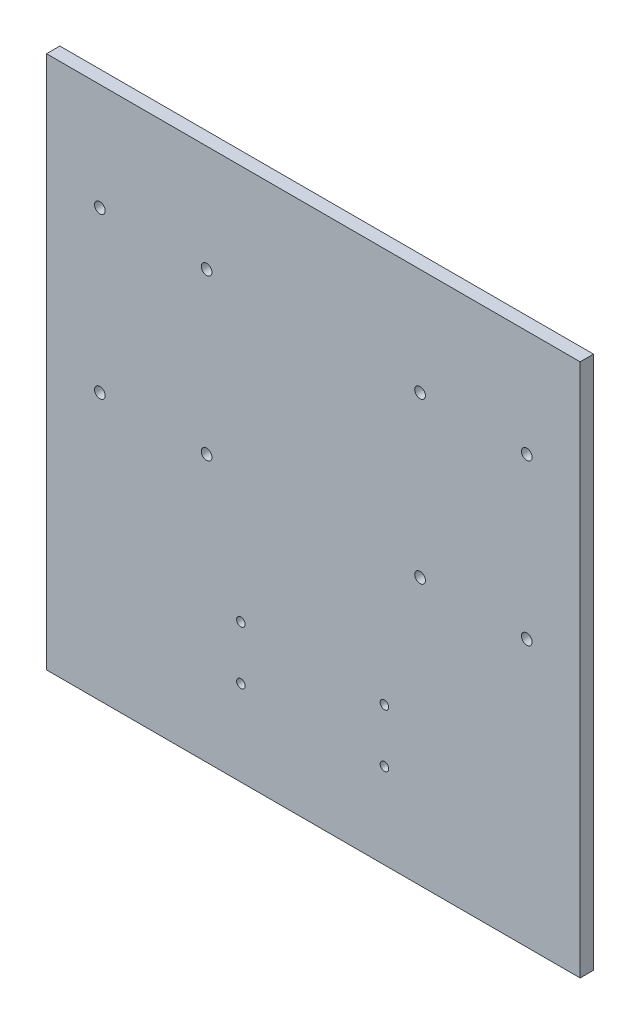
ISO-10303-21;
HEADER;
FILE_DESCRIPTION(('STEP AP214'),'2;1');
FILE_NAME('part.step','',(''),(''),'','','');
FILE_SCHEMA(('AUTOMOTIVE_DESIGN { 1 0 10303 214 1 1 1 1 }'));
ENDSEC;
DATA;
#1=APPLICATION_CONTEXT('core data for automotive mechanical design processes');
#2=APPLICATION_PROTOCOL_DEFINITION('international standard','automotive_design',2000,#1);
#3=PRODUCT_CONTEXT('',#1,'mechanical');
#4=PRODUCT('Part','Part','',(#3));
#5=PRODUCT_RELATED_PRODUCT_CATEGORY('part','',(#4));
#6=PRODUCT_DEFINITION_FORMATION('','',#4);
#7=PRODUCT_DEFINITION_CONTEXT('part definition',#1,'design');
#8=PRODUCT_DEFINITION('design','',#6,#7);
#9=PRODUCT_DEFINITION_SHAPE('','',#8);
#10=(LENGTH_UNIT() NAMED_UNIT(*) SI_UNIT(.MILLI.,.METRE.));
#11=(NAMED_UNIT(*) PLANE_ANGLE_UNIT() SI_UNIT($,.RADIAN.));
#12=(NAMED_UNIT(*) SI_UNIT($,.STERADIAN.) SOLID_ANGLE_UNIT());
#13=UNCERTAINTY_MEASURE_WITH_UNIT(LENGTH_MEASURE(1.E-05),#10,'distance_accuracy_value','');
#14=(GEOMETRIC_REPRESENTATION_CONTEXT(3) GLOBAL_UNCERTAINTY_ASSIGNED_CONTEXT((#13)) GLOBAL_UNIT_ASSIGNED_CONTEXT((#10,
#11,#12)) REPRESENTATION_CONTEXT('',''));
#15=CARTESIAN_POINT('',(0.,0.,0.));
#16=DIRECTION('',(0.,0.,1.));
#17=DIRECTION('',(1.,0.,0.));
#18=AXIS2_PLACEMENT_3D('',#15,#16,#17);
#19=CARTESIAN_POINT('',(100.,100.,5.));
#20=DIRECTION('',(-1.,0.,0.));
#21=DIRECTION('',(0.,-1.,0.));
#22=AXIS2_PLACEMENT_3D('',#19,#20,#21);
#23=PLANE('',#22);
#24=DIRECTION('',(0.,1.,0.));
#25=VECTOR('',#24,1.);
#26=CARTESIAN_POINT('',(100.,100.,0.));
#27=LINE('',#26,#25);
#28=CARTESIAN_POINT('',(100.,-100.,0.));
#29=VERTEX_POINT('',#28);
#30=CARTESIAN_POINT('',(100.,100.,0.));
#31=VERTEX_POINT('',#30);
#32=EDGE_CURVE('E102',#29,#31,#27,.T.);
#33=ORIENTED_EDGE('',*,*,#32,.T.);
#34=DIRECTION('',(0.,0.,-1.));
#35=VECTOR('',#34,1.);
#36=CARTESIAN_POINT('',(100.,100.,5.));
#37=LINE('',#36,#35);
#38=CARTESIAN_POINT('',(100.,100.,5.));
#39=VERTEX_POINT('',#38);
#40=EDGE_CURVE('E11',#39,#31,#37,.T.);
#41=ORIENTED_EDGE('',*,*,#40,.F.);
#42=DIRECTION('',(0.,1.,0.));
#43=VECTOR('',#42,1.);
#44=CARTESIAN_POINT('',(100.,100.,5.));
#45=LINE('',#44,#43);
#46=CARTESIAN_POINT('',(100.,-100.,5.));
#47=VERTEX_POINT('',#46);
#48=EDGE_CURVE('E90',#47,#39,#45,.T.);
#49=ORIENTED_EDGE('',*,*,#48,.F.);
#50=DIRECTION('',(0.,0.,-1.));
#51=VECTOR('',#50,1.);
#52=CARTESIAN_POINT('',(100.,-100.,5.));
#53=LINE('',#52,#51);
#54=EDGE_CURVE('E98',#47,#29,#53,.T.);
#55=ORIENTED_EDGE('',*,*,#54,.T.);
#56=EDGE_LOOP('',(#33,#41,#49,#55));
#57=FACE_BOUND('',#56,.T.);
#58=ADVANCED_FACE('F39',(#57),#23,.F.);
#59=CARTESIAN_POINT('',(-100.,100.,5.));
#60=DIRECTION('',(0.,-1.,0.));
#61=DIRECTION('',(0.,0.,-1.));
#62=AXIS2_PLACEMENT_3D('',#59,#60,#61);
#63=PLANE('',#62);
#64=DIRECTION('',(-1.,0.,0.));
#65=VECTOR('',#64,1.);
#66=CARTESIAN_POINT('',(-100.,100.,0.));
#67=LINE('',#66,#65);
#68=CARTESIAN_POINT('',(-100.,100.,0.));
#69=VERTEX_POINT('',#68);
#70=EDGE_CURVE('E94',#31,#69,#67,.T.);
#71=ORIENTED_EDGE('',*,*,#70,.T.);
#72=DIRECTION('',(0.,0.,-1.));
#73=VECTOR('',#72,1.);
#74=CARTESIAN_POINT('',(-100.,100.,5.));
#75=LINE('',#74,#73);
#76=CARTESIAN_POINT('',(-100.,100.,5.));
#77=VERTEX_POINT('',#76);
#78=EDGE_CURVE('E47',#77,#69,#75,.T.);
#79=ORIENTED_EDGE('',*,*,#78,.F.);
#80=DIRECTION('',(-1.,0.,0.));
#81=VECTOR('',#80,1.);
#82=CARTESIAN_POINT('',(-100.,100.,5.));
#83=LINE('',#82,#81);
#84=EDGE_CURVE('E85',#39,#77,#83,.T.);
#85=ORIENTED_EDGE('',*,*,#84,.F.);
#86=ORIENTED_EDGE('',*,*,#40,.T.);
#87=EDGE_LOOP('',(#71,#79,#85,#86));
#88=FACE_BOUND('',#87,.T.);
#89=ADVANCED_FACE('F93',(#88),#63,.F.);
#90=CARTESIAN_POINT('',(-100.,100.,5.));
#91=DIRECTION('',(1.,0.,0.));
#92=DIRECTION('',(0.,1.,0.));
#93=AXIS2_PLACEMENT_3D('',#90,#91,#92);
#94=PLANE('',#93);
#95=DIRECTION('',(0.,-1.,0.));
#96=VECTOR('',#95,1.);
#97=CARTESIAN_POINT('',(-100.,100.,0.));
#98=LINE('',#97,#96);
#99=CARTESIAN_POINT('',(-100.,-100.,0.));
#100=VERTEX_POINT('',#99);
#101=EDGE_CURVE('E72',#69,#100,#98,.T.);
#102=ORIENTED_EDGE('',*,*,#101,.T.);
#103=DIRECTION('',(0.,0.,-1.));
#104=VECTOR('',#103,1.);
#105=CARTESIAN_POINT('',(-100.,-100.,5.));
#106=LINE('',#105,#104);
#107=CARTESIAN_POINT('',(-100.,-100.,5.));
#108=VERTEX_POINT('',#107);
#109=EDGE_CURVE('E95',#108,#100,#106,.T.);
#110=ORIENTED_EDGE('',*,*,#109,.F.);
#111=DIRECTION('',(0.,-1.,0.));
#112=VECTOR('',#111,1.);
#113=CARTESIAN_POINT('',(-100.,100.,5.));
#114=LINE('',#113,#112);
#115=EDGE_CURVE('E88',#77,#108,#114,.T.);
#116=ORIENTED_EDGE('',*,*,#115,.F.);
#117=ORIENTED_EDGE('',*,*,#78,.T.);
#118=EDGE_LOOP('',(#102,#110,#116,#117));
#119=FACE_BOUND('',#118,.T.);
#120=ADVANCED_FACE('F96',(#119),#94,.F.);
#121=CARTESIAN_POINT('',(-100.,-100.,5.));
#122=DIRECTION('',(0.,1.,0.));
#123=DIRECTION('',(0.,0.,1.));
#124=AXIS2_PLACEMENT_3D('',#121,#122,#123);
#125=PLANE('',#124);
#126=DIRECTION('',(1.,0.,0.));
#127=VECTOR('',#126,1.);
#128=CARTESIAN_POINT('',(-100.,-100.,0.));
#129=LINE('',#128,#127);
#130=EDGE_CURVE('E78',#100,#29,#129,.T.);
#131=ORIENTED_EDGE('',*,*,#130,.T.);
#132=ORIENTED_EDGE('',*,*,#54,.F.);
#133=DIRECTION('',(1.,0.,0.));
#134=VECTOR('',#133,1.);
#135=CARTESIAN_POINT('',(-100.,-100.,5.));
#136=LINE('',#135,#134);
#137=EDGE_CURVE('E55',#108,#47,#136,.T.);
#138=ORIENTED_EDGE('',*,*,#137,.F.);
#139=ORIENTED_EDGE('',*,*,#109,.T.);
#140=EDGE_LOOP('',(#131,#132,#138,#139));
#141=FACE_BOUND('',#140,.T.);
#142=ADVANCED_FACE('F110',(#141),#125,.F.);
#143=CARTESIAN_POINT('',(0.,0.,5.));
#144=DIRECTION('',(0.,0.,1.));
#145=DIRECTION('',(1.,0.,0.));
#146=AXIS2_PLACEMENT_3D('',#143,#144,#145);
#147=PLANE('',#146);
#148=CARTESIAN_POINT('',(80.,0.,5.));
#149=DIRECTION('',(0.,0.,1.));
#150=DIRECTION('',(1.,0.,0.));
#151=AXIS2_PLACEMENT_3D('',#148,#149,#150);
#152=CIRCLE('',#151,2.);
#153=CARTESIAN_POINT('',(82.,0.,5.));
#154=VERTEX_POINT('',#153);
#155=EDGE_CURVE('E161',#154,#154,#152,.T.);
#156=ORIENTED_EDGE('',*,*,#155,.F.);
#157=EDGE_LOOP('',(#156));
#158=FACE_BOUND('',#157,.T.);
#159=CARTESIAN_POINT('',(-80.,0.,5.));
#160=DIRECTION('',(0.,0.,1.));
#161=DIRECTION('',(-1.,0.,0.));
#162=AXIS2_PLACEMENT_3D('',#159,#160,#161);
#163=CIRCLE('',#162,2.);
#164=CARTESIAN_POINT('',(-82.,0.,5.));
#165=VERTEX_POINT('',#164);
#166=EDGE_CURVE('E150',#165,#165,#163,.T.);
#167=ORIENTED_EDGE('',*,*,#166,.F.);
#168=EDGE_LOOP('',(#167));
#169=FACE_BOUND('',#168,.T.);
#170=CARTESIAN_POINT('',(-40.,0.,5.));
#171=DIRECTION('',(0.,0.,1.));
#172=DIRECTION('',(-1.,0.,0.));
#173=AXIS2_PLACEMENT_3D('',#170,#171,#172);
#174=CIRCLE('',#173,2.);
#175=CARTESIAN_POINT('',(-42.,0.,5.));
#176=VERTEX_POINT('',#175);
#177=EDGE_CURVE('E149',#176,#176,#174,.T.);
#178=ORIENTED_EDGE('',*,*,#177,.F.);
#179=EDGE_LOOP('',(#178));
#180=FACE_BOUND('',#179,.T.);
#181=CARTESIAN_POINT('',(-40.,60.,5.));
#182=DIRECTION('',(0.,0.,1.));
#183=DIRECTION('',(1.,0.,0.));
#184=AXIS2_PLACEMENT_3D('',#181,#182,#183);
#185=CIRCLE('',#184,2.);
#186=CARTESIAN_POINT('',(-38.,60.,5.));
#187=VERTEX_POINT('',#186);
#188=EDGE_CURVE('E143',#187,#187,#185,.T.);
#189=ORIENTED_EDGE('',*,*,#188,.F.);
#190=EDGE_LOOP('',(#189));
#191=FACE_BOUND('',#190,.T.);
#192=CARTESIAN_POINT('',(40.,0.,5.));
#193=DIRECTION('',(0.,0.,1.));
#194=DIRECTION('',(1.,0.,0.));
#195=AXIS2_PLACEMENT_3D('',#192,#193,#194);
#196=CIRCLE('',#195,2.);
#197=CARTESIAN_POINT('',(42.,0.,5.));
#198=VERTEX_POINT('',#197);
#199=EDGE_CURVE('E162',#198,#198,#196,.T.);
#200=ORIENTED_EDGE('',*,*,#199,.F.);
#201=EDGE_LOOP('',(#200));
#202=FACE_BOUND('',#201,.T.);
#203=CARTESIAN_POINT('',(40.,60.,5.));
#204=DIRECTION('',(0.,0.,1.));
#205=DIRECTION('',(-1.,0.,0.));
#206=AXIS2_PLACEMENT_3D('',#203,#204,#205);
#207=CIRCLE('',#206,2.);
#208=CARTESIAN_POINT('',(38.,60.,5.));
#209=VERTEX_POINT('',#208);
#210=EDGE_CURVE('E179',#209,#209,#207,.T.);
#211=ORIENTED_EDGE('',*,*,#210,.F.);
#212=EDGE_LOOP('',(#211));
#213=FACE_BOUND('',#212,.T.);
#214=CARTESIAN_POINT('',(80.,60.,5.));
#215=DIRECTION('',(0.,0.,1.));
#216=DIRECTION('',(-1.,0.,0.));
#217=AXIS2_PLACEMENT_3D('',#214,#215,#216);
#218=CIRCLE('',#217,2.);
#219=CARTESIAN_POINT('',(78.,60.,5.));
#220=VERTEX_POINT('',#219);
#221=EDGE_CURVE('E173',#220,#220,#218,.T.);
#222=ORIENTED_EDGE('',*,*,#221,.F.);
#223=EDGE_LOOP('',(#222));
#224=FACE_BOUND('',#223,.T.);
#225=CARTESIAN_POINT('',(-80.,60.,5.));
#226=DIRECTION('',(0.,0.,1.));
#227=DIRECTION('',(1.,0.,0.));
#228=AXIS2_PLACEMENT_3D('',#225,#226,#227);
#229=CIRCLE('',#228,2.);
#230=CARTESIAN_POINT('',(-78.,60.,5.));
#231=VERTEX_POINT('',#230);
#232=EDGE_CURVE('E140',#231,#231,#229,.T.);
#233=ORIENTED_EDGE('',*,*,#232,.F.);
#234=EDGE_LOOP('',(#233));
#235=FACE_BOUND('',#234,.T.);
#236=CARTESIAN_POINT('',(26.65,-68.,5.));
#237=DIRECTION('',(0.,0.,1.));
#238=DIRECTION('',(1.,0.,0.));
#239=AXIS2_PLACEMENT_3D('',#236,#237,#238);
#240=CIRCLE('',#239,1.60000000000001);
#241=CARTESIAN_POINT('',(28.25,-68.,5.));
#242=VERTEX_POINT('',#241);
#243=EDGE_CURVE('E125',#242,#242,#240,.T.);
#244=ORIENTED_EDGE('',*,*,#243,.F.);
#245=EDGE_LOOP('',(#244));
#246=FACE_BOUND('',#245,.T.);
#247=CARTESIAN_POINT('',(26.65,-48.,5.));
#248=DIRECTION('',(0.,0.,1.));
#249=DIRECTION('',(1.,0.,0.));
#250=AXIS2_PLACEMENT_3D('',#247,#248,#249);
#251=CIRCLE('',#250,1.60000000000001);
#252=CARTESIAN_POINT('',(28.25,-48.,5.));
#253=VERTEX_POINT('',#252);
#254=EDGE_CURVE('E132',#253,#253,#251,.T.);
#255=ORIENTED_EDGE('',*,*,#254,.F.);
#256=EDGE_LOOP('',(#255));
#257=FACE_BOUND('',#256,.T.);
#258=CARTESIAN_POINT('',(-27.1499999999999,-47.9999999999996,5.));
#259=DIRECTION('',(0.,0.,1.));
#260=DIRECTION('',(1.,0.,0.));
#261=AXIS2_PLACEMENT_3D('',#258,#259,#260);
#262=CIRCLE('',#261,1.60000000000001);
#263=CARTESIAN_POINT('',(-25.5499999999999,-47.9999999999996,5.));
#264=VERTEX_POINT('',#263);
#265=EDGE_CURVE('E119',#264,#264,#262,.T.);
#266=ORIENTED_EDGE('',*,*,#265,.F.);
#267=EDGE_LOOP('',(#266));
#268=FACE_BOUND('',#267,.T.);
#269=CARTESIAN_POINT('',(-27.1499999999999,-67.9999999999996,5.));
#270=DIRECTION('',(0.,0.,1.));
#271=DIRECTION('',(1.,0.,0.));
#272=AXIS2_PLACEMENT_3D('',#269,#270,#271);
#273=CIRCLE('',#272,1.60000000000001);
#274=CARTESIAN_POINT('',(-25.5499999999999,-67.9999999999996,5.));
#275=VERTEX_POINT('',#274);
#276=EDGE_CURVE('E116',#275,#275,#273,.T.);
#277=ORIENTED_EDGE('',*,*,#276,.F.);
#278=EDGE_LOOP('',(#277));
#279=FACE_BOUND('',#278,.T.);
#280=ORIENTED_EDGE('',*,*,#48,.T.);
#281=ORIENTED_EDGE('',*,*,#84,.T.);
#282=ORIENTED_EDGE('',*,*,#115,.T.);
#283=ORIENTED_EDGE('',*,*,#137,.T.);
#284=EDGE_LOOP('',(#280,#281,#282,#283));
#285=FACE_BOUND('',#284,.T.);
#286=ADVANCED_FACE('F86',(#158,#169,#180,#191,#202,#213,#224,#235,#246,#257,#268,#279,#285),
#147,.T.);
#287=CARTESIAN_POINT('',(0.,0.,0.));
#288=DIRECTION('',(0.,0.,1.));
#289=DIRECTION('',(1.,0.,0.));
#290=AXIS2_PLACEMENT_3D('',#287,#288,#289);
#291=PLANE('',#290);
#292=CARTESIAN_POINT('',(80.,0.,0.));
#293=DIRECTION('',(0.,0.,1.));
#294=DIRECTION('',(1.,0.,0.));
#295=AXIS2_PLACEMENT_3D('',#292,#293,#294);
#296=CIRCLE('',#295,2.);
#297=CARTESIAN_POINT('',(82.,0.,0.));
#298=VERTEX_POINT('',#297);
#299=EDGE_CURVE('E158',#298,#298,#296,.T.);
#300=ORIENTED_EDGE('',*,*,#299,.T.);
#301=EDGE_LOOP('',(#300));
#302=FACE_BOUND('',#301,.T.);
#303=CARTESIAN_POINT('',(-80.,0.,0.));
#304=DIRECTION('',(0.,0.,1.));
#305=DIRECTION('',(-1.,0.,0.));
#306=AXIS2_PLACEMENT_3D('',#303,#304,#305);
#307=CIRCLE('',#306,2.);
#308=CARTESIAN_POINT('',(-82.,0.,0.));
#309=VERTEX_POINT('',#308);
#310=EDGE_CURVE('E165',#309,#309,#307,.T.);
#311=ORIENTED_EDGE('',*,*,#310,.T.);
#312=EDGE_LOOP('',(#311));
#313=FACE_BOUND('',#312,.T.);
#314=CARTESIAN_POINT('',(-40.,0.,0.));
#315=DIRECTION('',(0.,0.,1.));
#316=DIRECTION('',(-1.,0.,0.));
#317=AXIS2_PLACEMENT_3D('',#314,#315,#316);
#318=CIRCLE('',#317,2.);
#319=CARTESIAN_POINT('',(-42.,0.,0.));
#320=VERTEX_POINT('',#319);
#321=EDGE_CURVE('E146',#320,#320,#318,.T.);
#322=ORIENTED_EDGE('',*,*,#321,.T.);
#323=EDGE_LOOP('',(#322));
#324=FACE_BOUND('',#323,.T.);
#325=CARTESIAN_POINT('',(-40.,60.,0.));
#326=DIRECTION('',(0.,0.,1.));
#327=DIRECTION('',(1.,0.,0.));
#328=AXIS2_PLACEMENT_3D('',#325,#326,#327);
#329=CIRCLE('',#328,2.);
#330=CARTESIAN_POINT('',(-38.,60.,0.));
#331=VERTEX_POINT('',#330);
#332=EDGE_CURVE('E153',#331,#331,#329,.T.);
#333=ORIENTED_EDGE('',*,*,#332,.T.);
#334=EDGE_LOOP('',(#333));
#335=FACE_BOUND('',#334,.T.);
#336=CARTESIAN_POINT('',(40.,0.,0.));
#337=DIRECTION('',(0.,0.,1.));
#338=DIRECTION('',(1.,0.,0.));
#339=AXIS2_PLACEMENT_3D('',#336,#337,#338);
#340=CIRCLE('',#339,2.);
#341=CARTESIAN_POINT('',(42.,0.,0.));
#342=VERTEX_POINT('',#341);
#343=EDGE_CURVE('E182',#342,#342,#340,.T.);
#344=ORIENTED_EDGE('',*,*,#343,.T.);
#345=EDGE_LOOP('',(#344));
#346=FACE_BOUND('',#345,.T.);
#347=CARTESIAN_POINT('',(40.,60.,0.));
#348=DIRECTION('',(0.,0.,1.));
#349=DIRECTION('',(-1.,0.,0.));
#350=AXIS2_PLACEMENT_3D('',#347,#348,#349);
#351=CIRCLE('',#350,2.);
#352=CARTESIAN_POINT('',(38.,60.,0.));
#353=VERTEX_POINT('',#352);
#354=EDGE_CURVE('E176',#353,#353,#351,.T.);
#355=ORIENTED_EDGE('',*,*,#354,.T.);
#356=EDGE_LOOP('',(#355));
#357=FACE_BOUND('',#356,.T.);
#358=CARTESIAN_POINT('',(80.,60.,0.));
#359=DIRECTION('',(0.,0.,1.));
#360=DIRECTION('',(-1.,0.,0.));
#361=AXIS2_PLACEMENT_3D('',#358,#359,#360);
#362=CIRCLE('',#361,2.);
#363=CARTESIAN_POINT('',(78.,60.,0.));
#364=VERTEX_POINT('',#363);
#365=EDGE_CURVE('E170',#364,#364,#362,.T.);
#366=ORIENTED_EDGE('',*,*,#365,.T.);
#367=EDGE_LOOP('',(#366));
#368=FACE_BOUND('',#367,.T.);
#369=CARTESIAN_POINT('',(-80.,60.,0.));
#370=DIRECTION('',(0.,0.,1.));
#371=DIRECTION('',(1.,0.,0.));
#372=AXIS2_PLACEMENT_3D('',#369,#370,#371);
#373=CIRCLE('',#372,2.);
#374=CARTESIAN_POINT('',(-78.,60.,0.));
#375=VERTEX_POINT('',#374);
#376=EDGE_CURVE('E126',#375,#375,#373,.T.);
#377=ORIENTED_EDGE('',*,*,#376,.T.);
#378=EDGE_LOOP('',(#377));
#379=FACE_BOUND('',#378,.T.);
#380=CARTESIAN_POINT('',(26.65,-68.,0.));
#381=DIRECTION('',(0.,0.,1.));
#382=DIRECTION('',(1.,0.,0.));
#383=AXIS2_PLACEMENT_3D('',#380,#381,#382);
#384=CIRCLE('',#383,1.60000000000001);
#385=CARTESIAN_POINT('',(28.25,-68.,0.));
#386=VERTEX_POINT('',#385);
#387=EDGE_CURVE('E122',#386,#386,#384,.T.);
#388=ORIENTED_EDGE('',*,*,#387,.T.);
#389=EDGE_LOOP('',(#388));
#390=FACE_BOUND('',#389,.T.);
#391=CARTESIAN_POINT('',(26.65,-48.,0.));
#392=DIRECTION('',(0.,0.,1.));
#393=DIRECTION('',(1.,0.,0.));
#394=AXIS2_PLACEMENT_3D('',#391,#392,#393);
#395=CIRCLE('',#394,1.60000000000001);
#396=CARTESIAN_POINT('',(28.25,-48.,0.));
#397=VERTEX_POINT('',#396);
#398=EDGE_CURVE('E129',#397,#397,#395,.T.);
#399=ORIENTED_EDGE('',*,*,#398,.T.);
#400=EDGE_LOOP('',(#399));
#401=FACE_BOUND('',#400,.T.);
#402=CARTESIAN_POINT('',(-27.1499999999999,-47.9999999999996,0.));
#403=DIRECTION('',(0.,0.,1.));
#404=DIRECTION('',(1.,0.,0.));
#405=AXIS2_PLACEMENT_3D('',#402,#403,#404);
#406=CIRCLE('',#405,1.60000000000001);
#407=CARTESIAN_POINT('',(-25.5499999999999,-47.9999999999996,0.));
#408=VERTEX_POINT('',#407);
#409=EDGE_CURVE('E135',#408,#408,#406,.T.);
#410=ORIENTED_EDGE('',*,*,#409,.T.);
#411=EDGE_LOOP('',(#410));
#412=FACE_BOUND('',#411,.T.);
#413=CARTESIAN_POINT('',(-27.1499999999999,-67.9999999999996,0.));
#414=DIRECTION('',(0.,0.,1.));
#415=DIRECTION('',(1.,0.,0.));
#416=AXIS2_PLACEMENT_3D('',#413,#414,#415);
#417=CIRCLE('',#416,1.60000000000001);
#418=CARTESIAN_POINT('',(-25.5499999999999,-67.9999999999996,0.));
#419=VERTEX_POINT('',#418);
#420=EDGE_CURVE('E105',#419,#419,#417,.T.);
#421=ORIENTED_EDGE('',*,*,#420,.T.);
#422=EDGE_LOOP('',(#421));
#423=FACE_BOUND('',#422,.T.);
#424=ORIENTED_EDGE('',*,*,#32,.F.);
#425=ORIENTED_EDGE('',*,*,#130,.F.);
#426=ORIENTED_EDGE('',*,*,#101,.F.);
#427=ORIENTED_EDGE('',*,*,#70,.F.);
#428=EDGE_LOOP('',(#424,#425,#426,#427));
#429=FACE_BOUND('',#428,.T.);
#430=ADVANCED_FACE('F113',(#302,#313,#324,#335,#346,#357,#368,#379,#390,#401,#412,#423,#429),
#291,.F.);
#431=CARTESIAN_POINT('',(-27.1499999999999,-67.9999999999996,0.));
#432=DIRECTION('',(0.,0.,1.));
#433=DIRECTION('',(1.,0.,0.));
#434=AXIS2_PLACEMENT_3D('',#431,#432,#433);
#435=CYLINDRICAL_SURFACE('',#434,1.60000000000001);
#436=ORIENTED_EDGE('',*,*,#420,.F.);
#437=EDGE_LOOP('',(#436));
#438=FACE_BOUND('',#437,.T.);
#439=ORIENTED_EDGE('',*,*,#276,.T.);
#440=EDGE_LOOP('',(#439));
#441=FACE_BOUND('',#440,.T.);
#442=ADVANCED_FACE('F208',(#438,#441),#435,.F.);
#443=CARTESIAN_POINT('',(-27.1499999999999,-47.9999999999996,0.));
#444=DIRECTION('',(0.,0.,1.));
#445=DIRECTION('',(1.,0.,0.));
#446=AXIS2_PLACEMENT_3D('',#443,#444,#445);
#447=CYLINDRICAL_SURFACE('',#446,1.60000000000001);
#448=ORIENTED_EDGE('',*,*,#409,.F.);
#449=EDGE_LOOP('',(#448));
#450=FACE_BOUND('',#449,.T.);
#451=ORIENTED_EDGE('',*,*,#265,.T.);
#452=EDGE_LOOP('',(#451));
#453=FACE_BOUND('',#452,.T.);
#454=ADVANCED_FACE('F210',(#450,#453),#447,.F.);
#455=CARTESIAN_POINT('',(26.65,-48.,0.));
#456=DIRECTION('',(0.,0.,1.));
#457=DIRECTION('',(1.,0.,0.));
#458=AXIS2_PLACEMENT_3D('',#455,#456,#457);
#459=CYLINDRICAL_SURFACE('',#458,1.60000000000001);
#460=ORIENTED_EDGE('',*,*,#398,.F.);
#461=EDGE_LOOP('',(#460));
#462=FACE_BOUND('',#461,.T.);
#463=ORIENTED_EDGE('',*,*,#254,.T.);
#464=EDGE_LOOP('',(#463));
#465=FACE_BOUND('',#464,.T.);
#466=ADVANCED_FACE('F217',(#462,#465),#459,.F.);
#467=CARTESIAN_POINT('',(26.65,-68.,0.));
#468=DIRECTION('',(0.,0.,1.));
#469=DIRECTION('',(1.,0.,0.));
#470=AXIS2_PLACEMENT_3D('',#467,#468,#469);
#471=CYLINDRICAL_SURFACE('',#470,1.60000000000001);
#472=ORIENTED_EDGE('',*,*,#387,.F.);
#473=EDGE_LOOP('',(#472));
#474=FACE_BOUND('',#473,.T.);
#475=ORIENTED_EDGE('',*,*,#243,.T.);
#476=EDGE_LOOP('',(#475));
#477=FACE_BOUND('',#476,.T.);
#478=ADVANCED_FACE('F260',(#474,#477),#471,.F.);
#479=CARTESIAN_POINT('',(-80.,60.,0.));
#480=DIRECTION('',(0.,0.,1.));
#481=DIRECTION('',(1.,0.,0.));
#482=AXIS2_PLACEMENT_3D('',#479,#480,#481);
#483=CYLINDRICAL_SURFACE('',#482,2.);
#484=ORIENTED_EDGE('',*,*,#376,.F.);
#485=EDGE_LOOP('',(#484));
#486=FACE_BOUND('',#485,.T.);
#487=ORIENTED_EDGE('',*,*,#232,.T.);
#488=EDGE_LOOP('',(#487));
#489=FACE_BOUND('',#488,.T.);
#490=ADVANCED_FACE('F254',(#486,#489),#483,.F.);
#491=CARTESIAN_POINT('',(80.,60.,0.));
#492=DIRECTION('',(0.,0.,1.));
#493=DIRECTION('',(1.,0.,0.));
#494=AXIS2_PLACEMENT_3D('',#491,#492,#493);
#495=CYLINDRICAL_SURFACE('',#494,2.);
#496=ORIENTED_EDGE('',*,*,#365,.F.);
#497=EDGE_LOOP('',(#496));
#498=FACE_BOUND('',#497,.T.);
#499=ORIENTED_EDGE('',*,*,#221,.T.);
#500=EDGE_LOOP('',(#499));
#501=FACE_BOUND('',#500,.T.);
#502=ADVANCED_FACE('F259',(#498,#501),#495,.F.);
#503=CARTESIAN_POINT('',(40.,60.,0.));
#504=DIRECTION('',(0.,0.,1.));
#505=DIRECTION('',(1.,0.,0.));
#506=AXIS2_PLACEMENT_3D('',#503,#504,#505);
#507=CYLINDRICAL_SURFACE('',#506,2.);
#508=ORIENTED_EDGE('',*,*,#354,.F.);
#509=EDGE_LOOP('',(#508));
#510=FACE_BOUND('',#509,.T.);
#511=ORIENTED_EDGE('',*,*,#210,.T.);
#512=EDGE_LOOP('',(#511));
#513=FACE_BOUND('',#512,.T.);
#514=ADVANCED_FACE('F273',(#510,#513),#507,.F.);
#515=CARTESIAN_POINT('',(40.,0.,0.));
#516=DIRECTION('',(0.,0.,1.));
#517=DIRECTION('',(1.,0.,0.));
#518=AXIS2_PLACEMENT_3D('',#515,#516,#517);
#519=CYLINDRICAL_SURFACE('',#518,2.);
#520=ORIENTED_EDGE('',*,*,#343,.F.);
#521=EDGE_LOOP('',(#520));
#522=FACE_BOUND('',#521,.T.);
#523=ORIENTED_EDGE('',*,*,#199,.T.);
#524=EDGE_LOOP('',(#523));
#525=FACE_BOUND('',#524,.T.);
#526=ADVANCED_FACE('F188',(#522,#525),#519,.F.);
#527=CARTESIAN_POINT('',(-40.,60.,0.));
#528=DIRECTION('',(0.,0.,1.));
#529=DIRECTION('',(1.,0.,0.));
#530=AXIS2_PLACEMENT_3D('',#527,#528,#529);
#531=CYLINDRICAL_SURFACE('',#530,2.);
#532=ORIENTED_EDGE('',*,*,#332,.F.);
#533=EDGE_LOOP('',(#532));
#534=FACE_BOUND('',#533,.T.);
#535=ORIENTED_EDGE('',*,*,#188,.T.);
#536=EDGE_LOOP('',(#535));
#537=FACE_BOUND('',#536,.T.);
#538=ADVANCED_FACE('F294',(#534,#537),#531,.F.);
#539=CARTESIAN_POINT('',(-40.,0.,0.));
#540=DIRECTION('',(0.,0.,1.));
#541=DIRECTION('',(1.,0.,0.));
#542=AXIS2_PLACEMENT_3D('',#539,#540,#541);
#543=CYLINDRICAL_SURFACE('',#542,2.);
#544=ORIENTED_EDGE('',*,*,#321,.F.);
#545=EDGE_LOOP('',(#544));
#546=FACE_BOUND('',#545,.T.);
#547=ORIENTED_EDGE('',*,*,#177,.T.);
#548=EDGE_LOOP('',(#547));
#549=FACE_BOUND('',#548,.T.);
#550=ADVANCED_FACE('F305',(#546,#549),#543,.F.);
#551=CARTESIAN_POINT('',(-80.,0.,0.));
#552=DIRECTION('',(0.,0.,1.));
#553=DIRECTION('',(1.,0.,0.));
#554=AXIS2_PLACEMENT_3D('',#551,#552,#553);
#555=CYLINDRICAL_SURFACE('',#554,2.);
#556=ORIENTED_EDGE('',*,*,#310,.F.);
#557=EDGE_LOOP('',(#556));
#558=FACE_BOUND('',#557,.T.);
#559=ORIENTED_EDGE('',*,*,#166,.T.);
#560=EDGE_LOOP('',(#559));
#561=FACE_BOUND('',#560,.T.);
#562=ADVANCED_FACE('F316',(#558,#561),#555,.F.);
#563=CARTESIAN_POINT('',(80.,0.,0.));
#564=DIRECTION('',(0.,0.,1.));
#565=DIRECTION('',(1.,0.,0.));
#566=AXIS2_PLACEMENT_3D('',#563,#564,#565);
#567=CYLINDRICAL_SURFACE('',#566,2.);
#568=ORIENTED_EDGE('',*,*,#299,.F.);
#569=EDGE_LOOP('',(#568));
#570=FACE_BOUND('',#569,.T.);
#571=ORIENTED_EDGE('',*,*,#155,.T.);
#572=EDGE_LOOP('',(#571));
#573=FACE_BOUND('',#572,.T.);
#574=ADVANCED_FACE('F327',(#570,#573),#567,.F.);
#575=CLOSED_SHELL('',(#58,#89,#120,#142,#286,#430,#442,#454,#466,#478,#490,#502,#514,#526,#538,
#550,#562,#574));
#576=MANIFOLD_SOLID_BREP('B2',#575);
#577=ADVANCED_BREP_SHAPE_REPRESENTATION('',(#18,#576),#14);
#578=SHAPE_DEFINITION_REPRESENTATION(#9,#577);
ENDSEC;
END-ISO-10303-21;
